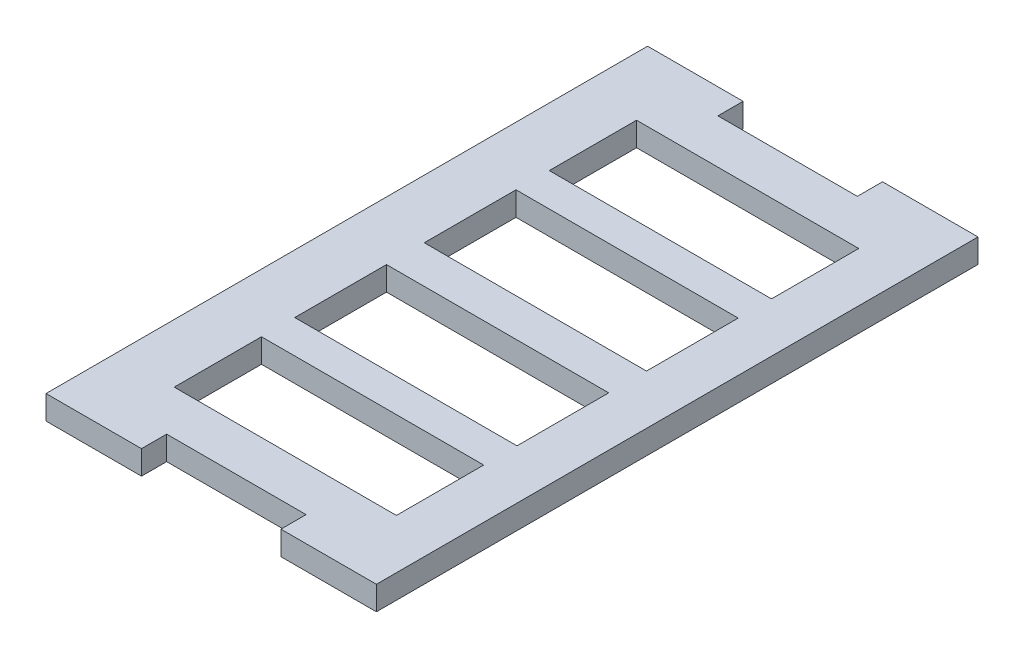
ISO-10303-21;
HEADER;
FILE_DESCRIPTION(('STEP AP214'),'2;1');
FILE_NAME('part.step','',(''),(''),'','','');
FILE_SCHEMA(('AUTOMOTIVE_DESIGN { 1 0 10303 214 1 1 1 1 }'));
ENDSEC;
DATA;
#1=APPLICATION_CONTEXT('core data for automotive mechanical design processes');
#2=APPLICATION_PROTOCOL_DEFINITION('international standard','automotive_design',2000,#1);
#3=PRODUCT_CONTEXT('',#1,'mechanical');
#4=PRODUCT('Part','Part','',(#3));
#5=PRODUCT_RELATED_PRODUCT_CATEGORY('part','',(#4));
#6=PRODUCT_DEFINITION_FORMATION('','',#4);
#7=PRODUCT_DEFINITION_CONTEXT('part definition',#1,'design');
#8=PRODUCT_DEFINITION('design','',#6,#7);
#9=PRODUCT_DEFINITION_SHAPE('','',#8);
#10=(LENGTH_UNIT() NAMED_UNIT(*) SI_UNIT(.MILLI.,.METRE.));
#11=(NAMED_UNIT(*) PLANE_ANGLE_UNIT() SI_UNIT($,.RADIAN.));
#12=(NAMED_UNIT(*) SI_UNIT($,.STERADIAN.) SOLID_ANGLE_UNIT());
#13=UNCERTAINTY_MEASURE_WITH_UNIT(LENGTH_MEASURE(1.E-05),#10,'distance_accuracy_value','');
#14=(GEOMETRIC_REPRESENTATION_CONTEXT(3) GLOBAL_UNCERTAINTY_ASSIGNED_CONTEXT((#13)) GLOBAL_UNIT_ASSIGNED_CONTEXT((#10,
#11,#12)) REPRESENTATION_CONTEXT('',''));
#15=CARTESIAN_POINT('',(0.,0.,0.));
#16=DIRECTION('',(0.,0.,1.));
#17=DIRECTION('',(1.,0.,0.));
#18=AXIS2_PLACEMENT_3D('',#15,#16,#17);
#19=CARTESIAN_POINT('',(0.,5.,0.));
#20=DIRECTION('',(0.,-1.,0.));
#21=DIRECTION('',(0.,0.,-1.));
#22=AXIS2_PLACEMENT_3D('',#19,#20,#21);
#23=PLANE('',#22);
#24=DIRECTION('',(1.,0.,0.));
#25=VECTOR('',#24,1.);
#26=CARTESIAN_POINT('',(-22.5088971814644,5.,55.734922510696));
#27=LINE('',#26,#25);
#28=CARTESIAN_POINT('',(-22.5088971814644,5.,55.734922510696));
#29=VERTEX_POINT('',#28);
#30=CARTESIAN_POINT('',(24.0307753905321,5.,55.734922510696));
#31=VERTEX_POINT('',#30);
#32=EDGE_CURVE('E254',#29,#31,#27,.T.);
#33=ORIENTED_EDGE('',*,*,#32,.F.);
#34=DIRECTION('',(0.,0.,1.));
#35=VECTOR('',#34,1.);
#36=CARTESIAN_POINT('',(-22.5088971814644,5.,55.734922510696));
#37=LINE('',#36,#35);
#38=CARTESIAN_POINT('',(-22.5088971814644,5.,36.5235838346414));
#39=VERTEX_POINT('',#38);
#40=EDGE_CURVE('E262',#39,#29,#37,.T.);
#41=ORIENTED_EDGE('',*,*,#40,.F.);
#42=DIRECTION('',(-1.,0.,0.));
#43=VECTOR('',#42,1.);
#44=CARTESIAN_POINT('',(-22.5088971814644,5.,36.5235838346414));
#45=LINE('',#44,#43);
#46=CARTESIAN_POINT('',(24.0307753905321,5.,36.5235838346414));
#47=VERTEX_POINT('',#46);
#48=EDGE_CURVE('E259',#47,#39,#45,.T.);
#49=ORIENTED_EDGE('',*,*,#48,.F.);
#50=DIRECTION('',(0.,0.,-1.));
#51=VECTOR('',#50,1.);
#52=CARTESIAN_POINT('',(24.0307753905321,5.,55.734922510696));
#53=LINE('',#52,#51);
#54=EDGE_CURVE('E256',#31,#47,#53,.T.);
#55=ORIENTED_EDGE('',*,*,#54,.F.);
#56=EDGE_LOOP('',(#33,#41,#49,#55));
#57=FACE_BOUND('',#56,.T.);
#58=DIRECTION('',(0.,0.,1.));
#59=VECTOR('',#58,1.);
#60=CARTESIAN_POINT('',(-22.5088971814644,5.,-15.8496267955484));
#61=LINE('',#60,#59);
#62=CARTESIAN_POINT('',(-22.5088971814644,5.,-15.8496267955484));
#63=VERTEX_POINT('',#62);
#64=CARTESIAN_POINT('',(-22.5088971814644,5.,2.42708672462842));
#65=VERTEX_POINT('',#64);
#66=EDGE_CURVE('E316',#63,#65,#61,.T.);
#67=ORIENTED_EDGE('',*,*,#66,.F.);
#68=DIRECTION('',(-1.,0.,0.));
#69=VECTOR('',#68,1.);
#70=CARTESIAN_POINT('',(-22.5088971814644,5.,-15.8496267955484));
#71=LINE('',#70,#69);
#72=CARTESIAN_POINT('',(24.0307753905321,5.,-15.8496267955484));
#73=VERTEX_POINT('',#72);
#74=EDGE_CURVE('E324',#73,#63,#71,.T.);
#75=ORIENTED_EDGE('',*,*,#74,.F.);
#76=DIRECTION('',(0.,0.,-1.));
#77=VECTOR('',#76,1.);
#78=CARTESIAN_POINT('',(24.0307753905321,5.,-15.8496267955484));
#79=LINE('',#78,#77);
#80=CARTESIAN_POINT('',(24.0307753905321,5.,2.42708672462842));
#81=VERTEX_POINT('',#80);
#82=EDGE_CURVE('E321',#81,#73,#79,.T.);
#83=ORIENTED_EDGE('',*,*,#82,.F.);
#84=DIRECTION('',(1.,0.,0.));
#85=VECTOR('',#84,1.);
#86=CARTESIAN_POINT('',(-22.5088971814644,5.,2.42708672462842));
#87=LINE('',#86,#85);
#88=EDGE_CURVE('E318',#65,#81,#87,.T.);
#89=ORIENTED_EDGE('',*,*,#88,.F.);
#90=EDGE_LOOP('',(#67,#75,#83,#89));
#91=FACE_BOUND('',#90,.T.);
#92=DIRECTION('',(0.,0.,1.));
#93=VECTOR('',#92,1.);
#94=CARTESIAN_POINT('',(-34.778811369509,5.,-25.4332304326133));
#95=LINE('',#94,#93);
#96=CARTESIAN_POINT('',(-34.778811369509,5.,-30.4332304326133));
#97=VERTEX_POINT('',#96);
#98=CARTESIAN_POINT('',(-34.778811369509,5.,95.5667695673867));
#99=VERTEX_POINT('',#98);
#100=EDGE_CURVE('E347',#97,#99,#95,.T.);
#101=ORIENTED_EDGE('',*,*,#100,.T.);
#102=DIRECTION('',(1.,0.,0.));
#103=VECTOR('',#102,1.);
#104=CARTESIAN_POINT('',(-34.778811369509,5.,95.5667695673867));
#105=LINE('',#104,#103);
#106=CARTESIAN_POINT('',(-14.778811369509,5.,95.5667695673867));
#107=VERTEX_POINT('',#106);
#108=EDGE_CURVE('E349',#99,#107,#105,.T.);
#109=ORIENTED_EDGE('',*,*,#108,.T.);
#110=DIRECTION('',(0.,0.,-1.));
#111=VECTOR('',#110,1.);
#112=CARTESIAN_POINT('',(-14.778811369509,5.,90.2959509895251));
#113=LINE('',#112,#111);
#114=CARTESIAN_POINT('',(-14.778811369509,5.,90.2959509895251));
#115=VERTEX_POINT('',#114);
#116=EDGE_CURVE('E352',#107,#115,#113,.T.);
#117=ORIENTED_EDGE('',*,*,#116,.T.);
#118=DIRECTION('',(1.,0.,0.));
#119=VECTOR('',#118,1.);
#120=CARTESIAN_POINT('',(-14.778811369509,5.,90.2959509895251));
#121=LINE('',#120,#119);
#122=CARTESIAN_POINT('',(14.421188630491,5.,90.2959509895251));
#123=VERTEX_POINT('',#122);
#124=EDGE_CURVE('E354',#115,#123,#121,.T.);
#125=ORIENTED_EDGE('',*,*,#124,.T.);
#126=DIRECTION('',(0.,0.,1.));
#127=VECTOR('',#126,1.);
#128=CARTESIAN_POINT('',(14.421188630491,5.,90.2959509895251));
#129=LINE('',#128,#127);
#130=CARTESIAN_POINT('',(14.421188630491,5.,95.5667695673867));
#131=VERTEX_POINT('',#130);
#132=EDGE_CURVE('E356',#123,#131,#129,.T.);
#133=ORIENTED_EDGE('',*,*,#132,.T.);
#134=DIRECTION('',(1.,0.,0.));
#135=VECTOR('',#134,1.);
#136=CARTESIAN_POINT('',(34.421188630491,5.,95.5667695673867));
#137=LINE('',#136,#135);
#138=CARTESIAN_POINT('',(34.421188630491,5.,95.5667695673867));
#139=VERTEX_POINT('',#138);
#140=EDGE_CURVE('E358',#131,#139,#137,.T.);
#141=ORIENTED_EDGE('',*,*,#140,.T.);
#142=DIRECTION('',(0.,0.,-1.));
#143=VECTOR('',#142,1.);
#144=CARTESIAN_POINT('',(34.421188630491,5.,90.5667695673867));
#145=LINE('',#144,#143);
#146=CARTESIAN_POINT('',(34.421188630491,5.,-30.4332304326133));
#147=VERTEX_POINT('',#146);
#148=EDGE_CURVE('E360',#139,#147,#145,.T.);
#149=ORIENTED_EDGE('',*,*,#148,.T.);
#150=DIRECTION('',(-1.,0.,0.));
#151=VECTOR('',#150,1.);
#152=CARTESIAN_POINT('',(34.421188630491,5.,-30.4332304326133));
#153=LINE('',#152,#151);
#154=CARTESIAN_POINT('',(14.421188630491,5.,-30.4332304326133));
#155=VERTEX_POINT('',#154);
#156=EDGE_CURVE('E362',#147,#155,#153,.T.);
#157=ORIENTED_EDGE('',*,*,#156,.T.);
#158=DIRECTION('',(0.,0.,1.));
#159=VECTOR('',#158,1.);
#160=CARTESIAN_POINT('',(14.421188630491,5.,-25.1624118547518));
#161=LINE('',#160,#159);
#162=CARTESIAN_POINT('',(14.421188630491,5.,-25.1624118547518));
#163=VERTEX_POINT('',#162);
#164=EDGE_CURVE('E364',#155,#163,#161,.T.);
#165=ORIENTED_EDGE('',*,*,#164,.T.);
#166=DIRECTION('',(-1.,0.,0.));
#167=VECTOR('',#166,1.);
#168=CARTESIAN_POINT('',(-14.778811369509,5.,-25.1624118547518));
#169=LINE('',#168,#167);
#170=CARTESIAN_POINT('',(-14.778811369509,5.,-25.1624118547518));
#171=VERTEX_POINT('',#170);
#172=EDGE_CURVE('E366',#163,#171,#169,.T.);
#173=ORIENTED_EDGE('',*,*,#172,.T.);
#174=DIRECTION('',(0.,0.,-1.));
#175=VECTOR('',#174,1.);
#176=CARTESIAN_POINT('',(-14.778811369509,5.,-25.1624118547518));
#177=LINE('',#176,#175);
#178=CARTESIAN_POINT('',(-14.778811369509,5.,-30.4332304326133));
#179=VERTEX_POINT('',#178);
#180=EDGE_CURVE('E368',#171,#179,#177,.T.);
#181=ORIENTED_EDGE('',*,*,#180,.T.);
#182=DIRECTION('',(-1.,0.,0.));
#183=VECTOR('',#182,1.);
#184=CARTESIAN_POINT('',(-34.778811369509,5.,-30.4332304326133));
#185=LINE('',#184,#183);
#186=EDGE_CURVE('E370',#179,#97,#185,.T.);
#187=ORIENTED_EDGE('',*,*,#186,.T.);
#188=EDGE_LOOP('',(#101,#109,#117,#125,#133,#141,#149,#157,#165,#173,#181,#187));
#189=FACE_BOUND('',#188,.T.);
#190=DIRECTION('',(0.,0.,1.));
#191=VECTOR('',#190,1.);
#192=CARTESIAN_POINT('',(-22.5088971814644,5.,9.39861662407728));
#193=LINE('',#192,#191);
#194=CARTESIAN_POINT('',(-22.5088971814644,5.,9.39861662407728));
#195=VERTEX_POINT('',#194);
#196=CARTESIAN_POINT('',(-22.5088971814644,5.,28.6099553001319));
#197=VERTEX_POINT('',#196);
#198=EDGE_CURVE('E285',#195,#197,#193,.T.);
#199=ORIENTED_EDGE('',*,*,#198,.F.);
#200=DIRECTION('',(-1.,0.,0.));
#201=VECTOR('',#200,1.);
#202=CARTESIAN_POINT('',(-22.5088971814644,5.,9.39861662407728));
#203=LINE('',#202,#201);
#204=CARTESIAN_POINT('',(24.0307753905321,5.,9.39861662407728));
#205=VERTEX_POINT('',#204);
#206=EDGE_CURVE('E293',#205,#195,#203,.T.);
#207=ORIENTED_EDGE('',*,*,#206,.F.);
#208=DIRECTION('',(0.,0.,-1.));
#209=VECTOR('',#208,1.);
#210=CARTESIAN_POINT('',(24.0307753905321,5.,9.39861662407728));
#211=LINE('',#210,#209);
#212=CARTESIAN_POINT('',(24.0307753905321,5.,28.6099553001319));
#213=VERTEX_POINT('',#212);
#214=EDGE_CURVE('E290',#213,#205,#211,.T.);
#215=ORIENTED_EDGE('',*,*,#214,.F.);
#216=DIRECTION('',(1.,0.,0.));
#217=VECTOR('',#216,1.);
#218=CARTESIAN_POINT('',(-22.5088971814644,5.,28.6099553001319));
#219=LINE('',#218,#217);
#220=EDGE_CURVE('E287',#197,#213,#219,.T.);
#221=ORIENTED_EDGE('',*,*,#220,.F.);
#222=EDGE_LOOP('',(#199,#207,#215,#221));
#223=FACE_BOUND('',#222,.T.);
#224=DIRECTION('',(1.,0.,0.));
#225=VECTOR('',#224,1.);
#226=CARTESIAN_POINT('',(-22.5088971814644,5.,80.9831659303217));
#227=LINE('',#226,#225);
#228=CARTESIAN_POINT('',(-22.5088971814644,5.,80.9831659303217));
#229=VERTEX_POINT('',#228);
#230=CARTESIAN_POINT('',(24.0307753905321,5.,80.9831659303217));
#231=VERTEX_POINT('',#230);
#232=EDGE_CURVE('E218',#229,#231,#227,.T.);
#233=ORIENTED_EDGE('',*,*,#232,.F.);
#234=DIRECTION('',(0.,0.,1.));
#235=VECTOR('',#234,1.);
#236=CARTESIAN_POINT('',(-22.5088971814644,5.,80.9831659303217));
#237=LINE('',#236,#235);
#238=CARTESIAN_POINT('',(-22.5088971814644,5.,62.7064524101449));
#239=VERTEX_POINT('',#238);
#240=EDGE_CURVE('E240',#239,#229,#237,.T.);
#241=ORIENTED_EDGE('',*,*,#240,.F.);
#242=DIRECTION('',(-1.,0.,0.));
#243=VECTOR('',#242,1.);
#244=CARTESIAN_POINT('',(-22.5088971814644,5.,62.7064524101449));
#245=LINE('',#244,#243);
#246=CARTESIAN_POINT('',(24.0307753905321,5.,62.7064524101449));
#247=VERTEX_POINT('',#246);
#248=EDGE_CURVE('E238',#247,#239,#245,.T.);
#249=ORIENTED_EDGE('',*,*,#248,.F.);
#250=DIRECTION('',(0.,0.,-1.));
#251=VECTOR('',#250,1.);
#252=CARTESIAN_POINT('',(24.0307753905321,5.,80.9831659303217));
#253=LINE('',#252,#251);
#254=EDGE_CURVE('E226',#231,#247,#253,.T.);
#255=ORIENTED_EDGE('',*,*,#254,.F.);
#256=EDGE_LOOP('',(#233,#241,#249,#255));
#257=FACE_BOUND('',#256,.T.);
#258=ADVANCED_FACE('F33',(#57,#91,#189,#223,#257),#23,.F.);
#259=CARTESIAN_POINT('',(0.,0.,0.));
#260=DIRECTION('',(0.,-1.,0.));
#261=DIRECTION('',(0.,0.,-1.));
#262=AXIS2_PLACEMENT_3D('',#259,#260,#261);
#263=PLANE('',#262);
#264=DIRECTION('',(0.,0.,1.));
#265=VECTOR('',#264,1.);
#266=CARTESIAN_POINT('',(-34.778811369509,0.,90.5667695673867));
#267=LINE('',#266,#265);
#268=CARTESIAN_POINT('',(-34.778811369509,0.,-30.4332304326133));
#269=VERTEX_POINT('',#268);
#270=CARTESIAN_POINT('',(-34.778811369509,0.,95.5667695673867));
#271=VERTEX_POINT('',#270);
#272=EDGE_CURVE('E346',#269,#271,#267,.T.);
#273=ORIENTED_EDGE('',*,*,#272,.F.);
#274=DIRECTION('',(-1.,0.,0.));
#275=VECTOR('',#274,1.);
#276=CARTESIAN_POINT('',(-34.778811369509,0.,-30.4332304326133));
#277=LINE('',#276,#275);
#278=CARTESIAN_POINT('',(-14.778811369509,0.,-30.4332304326133));
#279=VERTEX_POINT('',#278);
#280=EDGE_CURVE('E350',#279,#269,#277,.T.);
#281=ORIENTED_EDGE('',*,*,#280,.F.);
#282=DIRECTION('',(0.,0.,-1.));
#283=VECTOR('',#282,1.);
#284=CARTESIAN_POINT('',(-14.778811369509,0.,-25.1624118547518));
#285=LINE('',#284,#283);
#286=CARTESIAN_POINT('',(-14.778811369509,0.,-25.1624118547518));
#287=VERTEX_POINT('',#286);
#288=EDGE_CURVE('E393',#287,#279,#285,.T.);
#289=ORIENTED_EDGE('',*,*,#288,.F.);
#290=DIRECTION('',(-1.,0.,0.));
#291=VECTOR('',#290,1.);
#292=CARTESIAN_POINT('',(-14.778811369509,0.,-25.1624118547518));
#293=LINE('',#292,#291);
#294=CARTESIAN_POINT('',(14.421188630491,0.,-25.1624118547518));
#295=VERTEX_POINT('',#294);
#296=EDGE_CURVE('E391',#295,#287,#293,.T.);
#297=ORIENTED_EDGE('',*,*,#296,.F.);
#298=DIRECTION('',(0.,0.,1.));
#299=VECTOR('',#298,1.);
#300=CARTESIAN_POINT('',(14.421188630491,0.,-25.1624118547518));
#301=LINE('',#300,#299);
#302=CARTESIAN_POINT('',(14.421188630491,0.,-30.4332304326133));
#303=VERTEX_POINT('',#302);
#304=EDGE_CURVE('E389',#303,#295,#301,.T.);
#305=ORIENTED_EDGE('',*,*,#304,.F.);
#306=DIRECTION('',(-1.,0.,0.));
#307=VECTOR('',#306,1.);
#308=CARTESIAN_POINT('',(34.421188630491,0.,-30.4332304326133));
#309=LINE('',#308,#307);
#310=CARTESIAN_POINT('',(34.421188630491,0.,-30.4332304326133));
#311=VERTEX_POINT('',#310);
#312=EDGE_CURVE('E387',#311,#303,#309,.T.);
#313=ORIENTED_EDGE('',*,*,#312,.F.);
#314=DIRECTION('',(0.,0.,-1.));
#315=VECTOR('',#314,1.);
#316=CARTESIAN_POINT('',(34.421188630491,0.,-25.4332304326133));
#317=LINE('',#316,#315);
#318=CARTESIAN_POINT('',(34.421188630491,0.,95.5667695673867));
#319=VERTEX_POINT('',#318);
#320=EDGE_CURVE('E385',#319,#311,#317,.T.);
#321=ORIENTED_EDGE('',*,*,#320,.F.);
#322=DIRECTION('',(1.,0.,0.));
#323=VECTOR('',#322,1.);
#324=CARTESIAN_POINT('',(34.421188630491,0.,95.5667695673867));
#325=LINE('',#324,#323);
#326=CARTESIAN_POINT('',(14.421188630491,0.,95.5667695673867));
#327=VERTEX_POINT('',#326);
#328=EDGE_CURVE('E382',#327,#319,#325,.T.);
#329=ORIENTED_EDGE('',*,*,#328,.F.);
#330=DIRECTION('',(0.,0.,1.));
#331=VECTOR('',#330,1.);
#332=CARTESIAN_POINT('',(14.421188630491,0.,90.2959509895251));
#333=LINE('',#332,#331);
#334=CARTESIAN_POINT('',(14.421188630491,0.,90.2959509895251));
#335=VERTEX_POINT('',#334);
#336=EDGE_CURVE('E380',#335,#327,#333,.T.);
#337=ORIENTED_EDGE('',*,*,#336,.F.);
#338=DIRECTION('',(1.,0.,0.));
#339=VECTOR('',#338,1.);
#340=CARTESIAN_POINT('',(-14.778811369509,0.,90.2959509895251));
#341=LINE('',#340,#339);
#342=CARTESIAN_POINT('',(-14.778811369509,0.,90.2959509895251));
#343=VERTEX_POINT('',#342);
#344=EDGE_CURVE('E378',#343,#335,#341,.T.);
#345=ORIENTED_EDGE('',*,*,#344,.F.);
#346=DIRECTION('',(0.,0.,-1.));
#347=VECTOR('',#346,1.);
#348=CARTESIAN_POINT('',(-14.778811369509,0.,90.2959509895251));
#349=LINE('',#348,#347);
#350=CARTESIAN_POINT('',(-14.778811369509,0.,95.5667695673867));
#351=VERTEX_POINT('',#350);
#352=EDGE_CURVE('E376',#351,#343,#349,.T.);
#353=ORIENTED_EDGE('',*,*,#352,.F.);
#354=DIRECTION('',(1.,0.,0.));
#355=VECTOR('',#354,1.);
#356=CARTESIAN_POINT('',(-34.778811369509,0.,95.5667695673867));
#357=LINE('',#356,#355);
#358=EDGE_CURVE('E374',#271,#351,#357,.T.);
#359=ORIENTED_EDGE('',*,*,#358,.F.);
#360=EDGE_LOOP('',(#273,#281,#289,#297,#305,#313,#321,#329,#337,#345,#353,#359));
#361=FACE_BOUND('',#360,.T.);
#362=DIRECTION('',(-1.,0.,0.));
#363=VECTOR('',#362,1.);
#364=CARTESIAN_POINT('',(-22.5088971814644,0.,-15.8496267955484));
#365=LINE('',#364,#363);
#366=CARTESIAN_POINT('',(24.0307753905321,0.,-15.8496267955484));
#367=VERTEX_POINT('',#366);
#368=CARTESIAN_POINT('',(-22.5088971814644,0.,-15.8496267955484));
#369=VERTEX_POINT('',#368);
#370=EDGE_CURVE('E319',#367,#369,#365,.T.);
#371=ORIENTED_EDGE('',*,*,#370,.T.);
#372=DIRECTION('',(0.,0.,1.));
#373=VECTOR('',#372,1.);
#374=CARTESIAN_POINT('',(-22.5088971814644,0.,-15.8496267955484));
#375=LINE('',#374,#373);
#376=CARTESIAN_POINT('',(-22.5088971814644,0.,2.42708672462842));
#377=VERTEX_POINT('',#376);
#378=EDGE_CURVE('E315',#369,#377,#375,.T.);
#379=ORIENTED_EDGE('',*,*,#378,.T.);
#380=DIRECTION('',(1.,0.,0.));
#381=VECTOR('',#380,1.);
#382=CARTESIAN_POINT('',(-22.5088971814644,0.,2.42708672462842));
#383=LINE('',#382,#381);
#384=CARTESIAN_POINT('',(24.0307753905321,0.,2.42708672462842));
#385=VERTEX_POINT('',#384);
#386=EDGE_CURVE('E329',#377,#385,#383,.T.);
#387=ORIENTED_EDGE('',*,*,#386,.T.);
#388=DIRECTION('',(0.,0.,-1.));
#389=VECTOR('',#388,1.);
#390=CARTESIAN_POINT('',(24.0307753905321,0.,-15.8496267955484));
#391=LINE('',#390,#389);
#392=EDGE_CURVE('E332',#385,#367,#391,.T.);
#393=ORIENTED_EDGE('',*,*,#392,.T.);
#394=EDGE_LOOP('',(#371,#379,#387,#393));
#395=FACE_BOUND('',#394,.T.);
#396=DIRECTION('',(-1.,0.,0.));
#397=VECTOR('',#396,1.);
#398=CARTESIAN_POINT('',(-22.5088971814644,0.,9.39861662407728));
#399=LINE('',#398,#397);
#400=CARTESIAN_POINT('',(24.0307753905321,0.,9.39861662407728));
#401=VERTEX_POINT('',#400);
#402=CARTESIAN_POINT('',(-22.5088971814644,0.,9.39861662407728));
#403=VERTEX_POINT('',#402);
#404=EDGE_CURVE('E288',#401,#403,#399,.T.);
#405=ORIENTED_EDGE('',*,*,#404,.T.);
#406=DIRECTION('',(0.,0.,1.));
#407=VECTOR('',#406,1.);
#408=CARTESIAN_POINT('',(-22.5088971814644,0.,9.39861662407728));
#409=LINE('',#408,#407);
#410=CARTESIAN_POINT('',(-22.5088971814644,0.,28.6099553001319));
#411=VERTEX_POINT('',#410);
#412=EDGE_CURVE('E284',#403,#411,#409,.T.);
#413=ORIENTED_EDGE('',*,*,#412,.T.);
#414=DIRECTION('',(1.,0.,0.));
#415=VECTOR('',#414,1.);
#416=CARTESIAN_POINT('',(-22.5088971814644,0.,28.6099553001319));
#417=LINE('',#416,#415);
#418=CARTESIAN_POINT('',(24.0307753905321,0.,28.6099553001319));
#419=VERTEX_POINT('',#418);
#420=EDGE_CURVE('E298',#411,#419,#417,.T.);
#421=ORIENTED_EDGE('',*,*,#420,.T.);
#422=DIRECTION('',(0.,0.,-1.));
#423=VECTOR('',#422,1.);
#424=CARTESIAN_POINT('',(24.0307753905321,0.,9.39861662407728));
#425=LINE('',#424,#423);
#426=EDGE_CURVE('E301',#419,#401,#425,.T.);
#427=ORIENTED_EDGE('',*,*,#426,.T.);
#428=EDGE_LOOP('',(#405,#413,#421,#427));
#429=FACE_BOUND('',#428,.T.);
#430=DIRECTION('',(0.,0.,1.));
#431=VECTOR('',#430,1.);
#432=CARTESIAN_POINT('',(-22.5088971814644,0.,55.734922510696));
#433=LINE('',#432,#431);
#434=CARTESIAN_POINT('',(-22.5088971814644,0.,36.5235838346414));
#435=VERTEX_POINT('',#434);
#436=CARTESIAN_POINT('',(-22.5088971814644,0.,55.734922510696));
#437=VERTEX_POINT('',#436);
#438=EDGE_CURVE('E257',#435,#437,#433,.T.);
#439=ORIENTED_EDGE('',*,*,#438,.T.);
#440=DIRECTION('',(1.,0.,0.));
#441=VECTOR('',#440,1.);
#442=CARTESIAN_POINT('',(-22.5088971814644,0.,55.734922510696));
#443=LINE('',#442,#441);
#444=CARTESIAN_POINT('',(24.0307753905321,0.,55.734922510696));
#445=VERTEX_POINT('',#444);
#446=EDGE_CURVE('E234',#437,#445,#443,.T.);
#447=ORIENTED_EDGE('',*,*,#446,.T.);
#448=DIRECTION('',(0.,0.,-1.));
#449=VECTOR('',#448,1.);
#450=CARTESIAN_POINT('',(24.0307753905321,0.,55.734922510696));
#451=LINE('',#450,#449);
#452=CARTESIAN_POINT('',(24.0307753905321,0.,36.5235838346414));
#453=VERTEX_POINT('',#452);
#454=EDGE_CURVE('E267',#445,#453,#451,.T.);
#455=ORIENTED_EDGE('',*,*,#454,.T.);
#456=DIRECTION('',(-1.,0.,0.));
#457=VECTOR('',#456,1.);
#458=CARTESIAN_POINT('',(-22.5088971814644,0.,36.5235838346414));
#459=LINE('',#458,#457);
#460=EDGE_CURVE('E270',#453,#435,#459,.T.);
#461=ORIENTED_EDGE('',*,*,#460,.T.);
#462=EDGE_LOOP('',(#439,#447,#455,#461));
#463=FACE_BOUND('',#462,.T.);
#464=DIRECTION('',(0.,0.,1.));
#465=VECTOR('',#464,1.);
#466=CARTESIAN_POINT('',(-22.5088971814644,0.,80.9831659303217));
#467=LINE('',#466,#465);
#468=CARTESIAN_POINT('',(-22.5088971814644,0.,62.7064524101449));
#469=VERTEX_POINT('',#468);
#470=CARTESIAN_POINT('',(-22.5088971814644,0.,80.9831659303217));
#471=VERTEX_POINT('',#470);
#472=EDGE_CURVE('E227',#469,#471,#467,.T.);
#473=ORIENTED_EDGE('',*,*,#472,.T.);
#474=DIRECTION('',(1.,0.,0.));
#475=VECTOR('',#474,1.);
#476=CARTESIAN_POINT('',(-22.5088971814644,0.,80.9831659303217));
#477=LINE('',#476,#475);
#478=CARTESIAN_POINT('',(24.0307753905321,0.,80.9831659303217));
#479=VERTEX_POINT('',#478);
#480=EDGE_CURVE('E56',#471,#479,#477,.T.);
#481=ORIENTED_EDGE('',*,*,#480,.T.);
#482=DIRECTION('',(0.,0.,-1.));
#483=VECTOR('',#482,1.);
#484=CARTESIAN_POINT('',(24.0307753905321,0.,80.9831659303217));
#485=LINE('',#484,#483);
#486=CARTESIAN_POINT('',(24.0307753905321,0.,62.7064524101449));
#487=VERTEX_POINT('',#486);
#488=EDGE_CURVE('E233',#479,#487,#485,.T.);
#489=ORIENTED_EDGE('',*,*,#488,.T.);
#490=DIRECTION('',(-1.,0.,0.));
#491=VECTOR('',#490,1.);
#492=CARTESIAN_POINT('',(-22.5088971814644,0.,62.7064524101449));
#493=LINE('',#492,#491);
#494=EDGE_CURVE('E246',#487,#469,#493,.T.);
#495=ORIENTED_EDGE('',*,*,#494,.T.);
#496=EDGE_LOOP('',(#473,#481,#489,#495));
#497=FACE_BOUND('',#496,.T.);
#498=ADVANCED_FACE('F437',(#361,#395,#429,#463,#497),#263,.T.);
#499=CARTESIAN_POINT('',(-34.778811369509,5.,90.5667695673867));
#500=DIRECTION('',(1.,0.,0.));
#501=DIRECTION('',(0.,0.,-1.));
#502=AXIS2_PLACEMENT_3D('',#499,#500,#501);
#503=PLANE('',#502);
#504=ORIENTED_EDGE('',*,*,#272,.T.);
#505=DIRECTION('',(0.,-1.,0.));
#506=VECTOR('',#505,1.);
#507=CARTESIAN_POINT('',(-34.778811369509,5.,95.5667695673867));
#508=LINE('',#507,#506);
#509=EDGE_CURVE('E11',#99,#271,#508,.T.);
#510=ORIENTED_EDGE('',*,*,#509,.F.);
#511=ORIENTED_EDGE('',*,*,#100,.F.);
#512=DIRECTION('',(0.,-1.,0.));
#513=VECTOR('',#512,1.);
#514=CARTESIAN_POINT('',(-34.778811369509,5.,-30.4332304326133));
#515=LINE('',#514,#513);
#516=EDGE_CURVE('E372',#97,#269,#515,.T.);
#517=ORIENTED_EDGE('',*,*,#516,.T.);
#518=EDGE_LOOP('',(#504,#510,#511,#517));
#519=FACE_BOUND('',#518,.T.);
#520=ADVANCED_FACE('F35',(#519),#503,.F.);
#521=CARTESIAN_POINT('',(-34.778811369509,5.,95.5667695673867));
#522=DIRECTION('',(0.,0.,-1.));
#523=DIRECTION('',(-1.,0.,0.));
#524=AXIS2_PLACEMENT_3D('',#521,#522,#523);
#525=PLANE('',#524);
#526=ORIENTED_EDGE('',*,*,#358,.T.);
#527=DIRECTION('',(0.,-1.,0.));
#528=VECTOR('',#527,1.);
#529=CARTESIAN_POINT('',(-14.778811369509,5.,95.5667695673867));
#530=LINE('',#529,#528);
#531=EDGE_CURVE('E41',#107,#351,#530,.T.);
#532=ORIENTED_EDGE('',*,*,#531,.F.);
#533=ORIENTED_EDGE('',*,*,#108,.F.);
#534=ORIENTED_EDGE('',*,*,#509,.T.);
#535=EDGE_LOOP('',(#526,#532,#533,#534));
#536=FACE_BOUND('',#535,.T.);
#537=ADVANCED_FACE('F455',(#536),#525,.F.);
#538=CARTESIAN_POINT('',(-14.778811369509,5.,90.2959509895251));
#539=DIRECTION('',(-1.,0.,0.));
#540=DIRECTION('',(0.,0.,1.));
#541=AXIS2_PLACEMENT_3D('',#538,#539,#540);
#542=PLANE('',#541);
#543=ORIENTED_EDGE('',*,*,#352,.T.);
#544=DIRECTION('',(0.,-1.,0.));
#545=VECTOR('',#544,1.);
#546=CARTESIAN_POINT('',(-14.778811369509,5.,90.2959509895251));
#547=LINE('',#546,#545);
#548=EDGE_CURVE('E423',#115,#343,#547,.T.);
#549=ORIENTED_EDGE('',*,*,#548,.F.);
#550=ORIENTED_EDGE('',*,*,#116,.F.);
#551=ORIENTED_EDGE('',*,*,#531,.T.);
#552=EDGE_LOOP('',(#543,#549,#550,#551));
#553=FACE_BOUND('',#552,.T.);
#554=ADVANCED_FACE('F430',(#553),#542,.F.);
#555=CARTESIAN_POINT('',(-14.778811369509,5.,90.2959509895251));
#556=DIRECTION('',(0.,0.,-1.));
#557=DIRECTION('',(-1.,0.,0.));
#558=AXIS2_PLACEMENT_3D('',#555,#556,#557);
#559=PLANE('',#558);
#560=ORIENTED_EDGE('',*,*,#344,.T.);
#561=DIRECTION('',(0.,-1.,0.));
#562=VECTOR('',#561,1.);
#563=CARTESIAN_POINT('',(14.421188630491,5.,90.2959509895251));
#564=LINE('',#563,#562);
#565=EDGE_CURVE('E420',#123,#335,#564,.T.);
#566=ORIENTED_EDGE('',*,*,#565,.F.);
#567=ORIENTED_EDGE('',*,*,#124,.F.);
#568=ORIENTED_EDGE('',*,*,#548,.T.);
#569=EDGE_LOOP('',(#560,#566,#567,#568));
#570=FACE_BOUND('',#569,.T.);
#571=ADVANCED_FACE('F443',(#570),#559,.F.);
#572=CARTESIAN_POINT('',(14.421188630491,5.,90.2959509895251));
#573=DIRECTION('',(1.,0.,0.));
#574=DIRECTION('',(0.,0.,-1.));
#575=AXIS2_PLACEMENT_3D('',#572,#573,#574);
#576=PLANE('',#575);
#577=ORIENTED_EDGE('',*,*,#336,.T.);
#578=DIRECTION('',(0.,-1.,0.));
#579=VECTOR('',#578,1.);
#580=CARTESIAN_POINT('',(14.421188630491,5.,95.5667695673867));
#581=LINE('',#580,#579);
#582=EDGE_CURVE('E417',#131,#327,#581,.T.);
#583=ORIENTED_EDGE('',*,*,#582,.F.);
#584=ORIENTED_EDGE('',*,*,#132,.F.);
#585=ORIENTED_EDGE('',*,*,#565,.T.);
#586=EDGE_LOOP('',(#577,#583,#584,#585));
#587=FACE_BOUND('',#586,.T.);
#588=ADVANCED_FACE('F447',(#587),#576,.F.);
#589=CARTESIAN_POINT('',(34.421188630491,5.,95.5667695673867));
#590=DIRECTION('',(0.,0.,-1.));
#591=DIRECTION('',(-1.,0.,0.));
#592=AXIS2_PLACEMENT_3D('',#589,#590,#591);
#593=PLANE('',#592);
#594=ORIENTED_EDGE('',*,*,#328,.T.);
#595=DIRECTION('',(0.,-1.,0.));
#596=VECTOR('',#595,1.);
#597=CARTESIAN_POINT('',(34.421188630491,5.,95.5667695673867));
#598=LINE('',#597,#596);
#599=EDGE_CURVE('E414',#139,#319,#598,.T.);
#600=ORIENTED_EDGE('',*,*,#599,.F.);
#601=ORIENTED_EDGE('',*,*,#140,.F.);
#602=ORIENTED_EDGE('',*,*,#582,.T.);
#603=EDGE_LOOP('',(#594,#600,#601,#602));
#604=FACE_BOUND('',#603,.T.);
#605=ADVANCED_FACE('F485',(#604),#593,.F.);
#606=CARTESIAN_POINT('',(34.421188630491,5.,-25.4332304326133));
#607=DIRECTION('',(-1.,0.,0.));
#608=DIRECTION('',(0.,0.,1.));
#609=AXIS2_PLACEMENT_3D('',#606,#607,#608);
#610=PLANE('',#609);
#611=ORIENTED_EDGE('',*,*,#320,.T.);
#612=DIRECTION('',(0.,-1.,0.));
#613=VECTOR('',#612,1.);
#614=CARTESIAN_POINT('',(34.421188630491,5.,-30.4332304326133));
#615=LINE('',#614,#613);
#616=EDGE_CURVE('E411',#147,#311,#615,.T.);
#617=ORIENTED_EDGE('',*,*,#616,.F.);
#618=ORIENTED_EDGE('',*,*,#148,.F.);
#619=ORIENTED_EDGE('',*,*,#599,.T.);
#620=EDGE_LOOP('',(#611,#617,#618,#619));
#621=FACE_BOUND('',#620,.T.);
#622=ADVANCED_FACE('F487',(#621),#610,.F.);
#623=CARTESIAN_POINT('',(34.421188630491,5.,-30.4332304326133));
#624=DIRECTION('',(0.,0.,1.));
#625=DIRECTION('',(1.,0.,0.));
#626=AXIS2_PLACEMENT_3D('',#623,#624,#625);
#627=PLANE('',#626);
#628=ORIENTED_EDGE('',*,*,#312,.T.);
#629=DIRECTION('',(0.,-1.,0.));
#630=VECTOR('',#629,1.);
#631=CARTESIAN_POINT('',(14.421188630491,5.,-30.4332304326133));
#632=LINE('',#631,#630);
#633=EDGE_CURVE('E408',#155,#303,#632,.T.);
#634=ORIENTED_EDGE('',*,*,#633,.F.);
#635=ORIENTED_EDGE('',*,*,#156,.F.);
#636=ORIENTED_EDGE('',*,*,#616,.T.);
#637=EDGE_LOOP('',(#628,#634,#635,#636));
#638=FACE_BOUND('',#637,.T.);
#639=ADVANCED_FACE('F481',(#638),#627,.F.);
#640=CARTESIAN_POINT('',(14.421188630491,5.,-25.1624118547518));
#641=DIRECTION('',(1.,0.,0.));
#642=DIRECTION('',(0.,0.,-1.));
#643=AXIS2_PLACEMENT_3D('',#640,#641,#642);
#644=PLANE('',#643);
#645=ORIENTED_EDGE('',*,*,#304,.T.);
#646=DIRECTION('',(0.,-1.,0.));
#647=VECTOR('',#646,1.);
#648=CARTESIAN_POINT('',(14.421188630491,5.,-25.1624118547518));
#649=LINE('',#648,#647);
#650=EDGE_CURVE('E405',#163,#295,#649,.T.);
#651=ORIENTED_EDGE('',*,*,#650,.F.);
#652=ORIENTED_EDGE('',*,*,#164,.F.);
#653=ORIENTED_EDGE('',*,*,#633,.T.);
#654=EDGE_LOOP('',(#645,#651,#652,#653));
#655=FACE_BOUND('',#654,.T.);
#656=ADVANCED_FACE('F477',(#655),#644,.F.);
#657=CARTESIAN_POINT('',(-14.778811369509,5.,-25.1624118547518));
#658=DIRECTION('',(0.,0.,1.));
#659=DIRECTION('',(1.,0.,0.));
#660=AXIS2_PLACEMENT_3D('',#657,#658,#659);
#661=PLANE('',#660);
#662=ORIENTED_EDGE('',*,*,#296,.T.);
#663=DIRECTION('',(0.,-1.,0.));
#664=VECTOR('',#663,1.);
#665=CARTESIAN_POINT('',(-14.778811369509,5.,-25.1624118547518));
#666=LINE('',#665,#664);
#667=EDGE_CURVE('E402',#171,#287,#666,.T.);
#668=ORIENTED_EDGE('',*,*,#667,.F.);
#669=ORIENTED_EDGE('',*,*,#172,.F.);
#670=ORIENTED_EDGE('',*,*,#650,.T.);
#671=EDGE_LOOP('',(#662,#668,#669,#670));
#672=FACE_BOUND('',#671,.T.);
#673=ADVANCED_FACE('F472',(#672),#661,.F.);
#674=CARTESIAN_POINT('',(-14.778811369509,5.,-25.1624118547518));
#675=DIRECTION('',(-1.,0.,0.));
#676=DIRECTION('',(0.,0.,1.));
#677=AXIS2_PLACEMENT_3D('',#674,#675,#676);
#678=PLANE('',#677);
#679=ORIENTED_EDGE('',*,*,#288,.T.);
#680=DIRECTION('',(0.,-1.,0.));
#681=VECTOR('',#680,1.);
#682=CARTESIAN_POINT('',(-14.778811369509,5.,-30.4332304326133));
#683=LINE('',#682,#681);
#684=EDGE_CURVE('E399',#179,#279,#683,.T.);
#685=ORIENTED_EDGE('',*,*,#684,.F.);
#686=ORIENTED_EDGE('',*,*,#180,.F.);
#687=ORIENTED_EDGE('',*,*,#667,.T.);
#688=EDGE_LOOP('',(#679,#685,#686,#687));
#689=FACE_BOUND('',#688,.T.);
#690=ADVANCED_FACE('F466',(#689),#678,.F.);
#691=CARTESIAN_POINT('',(-34.778811369509,5.,-30.4332304326133));
#692=DIRECTION('',(0.,0.,1.));
#693=DIRECTION('',(1.,0.,0.));
#694=AXIS2_PLACEMENT_3D('',#691,#692,#693);
#695=PLANE('',#694);
#696=ORIENTED_EDGE('',*,*,#280,.T.);
#697=ORIENTED_EDGE('',*,*,#516,.F.);
#698=ORIENTED_EDGE('',*,*,#186,.F.);
#699=ORIENTED_EDGE('',*,*,#684,.T.);
#700=EDGE_LOOP('',(#696,#697,#698,#699));
#701=FACE_BOUND('',#700,.T.);
#702=ADVANCED_FACE('F461',(#701),#695,.F.);
#703=CARTESIAN_POINT('',(-22.5088971814644,5.,-15.8496267955484));
#704=DIRECTION('',(1.,0.,0.));
#705=DIRECTION('',(0.,0.,-1.));
#706=AXIS2_PLACEMENT_3D('',#703,#704,#705);
#707=PLANE('',#706);
#708=ORIENTED_EDGE('',*,*,#378,.F.);
#709=DIRECTION('',(0.,-1.,0.));
#710=VECTOR('',#709,1.);
#711=CARTESIAN_POINT('',(-22.5088971814644,5.,-15.8496267955484));
#712=LINE('',#711,#710);
#713=EDGE_CURVE('E326',#63,#369,#712,.T.);
#714=ORIENTED_EDGE('',*,*,#713,.F.);
#715=ORIENTED_EDGE('',*,*,#66,.T.);
#716=DIRECTION('',(0.,-1.,0.));
#717=VECTOR('',#716,1.);
#718=CARTESIAN_POINT('',(-22.5088971814644,5.,2.42708672462842));
#719=LINE('',#718,#717);
#720=EDGE_CURVE('E343',#65,#377,#719,.T.);
#721=ORIENTED_EDGE('',*,*,#720,.T.);
#722=EDGE_LOOP('',(#708,#714,#715,#721));
#723=FACE_BOUND('',#722,.T.);
#724=ADVANCED_FACE('F506',(#723),#707,.T.);
#725=CARTESIAN_POINT('',(-22.5088971814644,5.,2.42708672462842));
#726=DIRECTION('',(0.,0.,-1.));
#727=DIRECTION('',(-1.,0.,0.));
#728=AXIS2_PLACEMENT_3D('',#725,#726,#727);
#729=PLANE('',#728);
#730=ORIENTED_EDGE('',*,*,#386,.F.);
#731=ORIENTED_EDGE('',*,*,#720,.F.);
#732=ORIENTED_EDGE('',*,*,#88,.T.);
#733=DIRECTION('',(0.,-1.,0.));
#734=VECTOR('',#733,1.);
#735=CARTESIAN_POINT('',(24.0307753905321,5.,2.42708672462842));
#736=LINE('',#735,#734);
#737=EDGE_CURVE('E341',#81,#385,#736,.T.);
#738=ORIENTED_EDGE('',*,*,#737,.T.);
#739=EDGE_LOOP('',(#730,#731,#732,#738));
#740=FACE_BOUND('',#739,.T.);
#741=ADVANCED_FACE('F538',(#740),#729,.T.);
#742=CARTESIAN_POINT('',(24.0307753905321,5.,-15.8496267955484));
#743=DIRECTION('',(-1.,0.,0.));
#744=DIRECTION('',(0.,0.,1.));
#745=AXIS2_PLACEMENT_3D('',#742,#743,#744);
#746=PLANE('',#745);
#747=ORIENTED_EDGE('',*,*,#392,.F.);
#748=ORIENTED_EDGE('',*,*,#737,.F.);
#749=ORIENTED_EDGE('',*,*,#82,.T.);
#750=DIRECTION('',(0.,-1.,0.));
#751=VECTOR('',#750,1.);
#752=CARTESIAN_POINT('',(24.0307753905321,5.,-15.8496267955484));
#753=LINE('',#752,#751);
#754=EDGE_CURVE('E339',#73,#367,#753,.T.);
#755=ORIENTED_EDGE('',*,*,#754,.T.);
#756=EDGE_LOOP('',(#747,#748,#749,#755));
#757=FACE_BOUND('',#756,.T.);
#758=ADVANCED_FACE('F545',(#757),#746,.T.);
#759=CARTESIAN_POINT('',(-22.5088971814644,5.,-15.8496267955484));
#760=DIRECTION('',(0.,0.,1.));
#761=DIRECTION('',(1.,0.,0.));
#762=AXIS2_PLACEMENT_3D('',#759,#760,#761);
#763=PLANE('',#762);
#764=ORIENTED_EDGE('',*,*,#370,.F.);
#765=ORIENTED_EDGE('',*,*,#754,.F.);
#766=ORIENTED_EDGE('',*,*,#74,.T.);
#767=ORIENTED_EDGE('',*,*,#713,.T.);
#768=EDGE_LOOP('',(#764,#765,#766,#767));
#769=FACE_BOUND('',#768,.T.);
#770=ADVANCED_FACE('F552',(#769),#763,.T.);
#771=CARTESIAN_POINT('',(-22.5088971814644,5.,9.39861662407728));
#772=DIRECTION('',(1.,0.,0.));
#773=DIRECTION('',(0.,0.,-1.));
#774=AXIS2_PLACEMENT_3D('',#771,#772,#773);
#775=PLANE('',#774);
#776=ORIENTED_EDGE('',*,*,#412,.F.);
#777=DIRECTION('',(0.,-1.,0.));
#778=VECTOR('',#777,1.);
#779=CARTESIAN_POINT('',(-22.5088971814644,5.,9.39861662407728));
#780=LINE('',#779,#778);
#781=EDGE_CURVE('E295',#195,#403,#780,.T.);
#782=ORIENTED_EDGE('',*,*,#781,.F.);
#783=ORIENTED_EDGE('',*,*,#198,.T.);
#784=DIRECTION('',(0.,-1.,0.));
#785=VECTOR('',#784,1.);
#786=CARTESIAN_POINT('',(-22.5088971814644,5.,28.6099553001319));
#787=LINE('',#786,#785);
#788=EDGE_CURVE('E312',#197,#411,#787,.T.);
#789=ORIENTED_EDGE('',*,*,#788,.T.);
#790=EDGE_LOOP('',(#776,#782,#783,#789));
#791=FACE_BOUND('',#790,.T.);
#792=ADVANCED_FACE('F560',(#791),#775,.T.);
#793=CARTESIAN_POINT('',(-22.5088971814644,5.,28.6099553001319));
#794=DIRECTION('',(0.,0.,-1.));
#795=DIRECTION('',(-1.,0.,0.));
#796=AXIS2_PLACEMENT_3D('',#793,#794,#795);
#797=PLANE('',#796);
#798=ORIENTED_EDGE('',*,*,#420,.F.);
#799=ORIENTED_EDGE('',*,*,#788,.F.);
#800=ORIENTED_EDGE('',*,*,#220,.T.);
#801=DIRECTION('',(0.,-1.,0.));
#802=VECTOR('',#801,1.);
#803=CARTESIAN_POINT('',(24.0307753905321,5.,28.6099553001319));
#804=LINE('',#803,#802);
#805=EDGE_CURVE('E310',#213,#419,#804,.T.);
#806=ORIENTED_EDGE('',*,*,#805,.T.);
#807=EDGE_LOOP('',(#798,#799,#800,#806));
#808=FACE_BOUND('',#807,.T.);
#809=ADVANCED_FACE('F568',(#808),#797,.T.);
#810=CARTESIAN_POINT('',(24.0307753905321,5.,9.39861662407728));
#811=DIRECTION('',(-1.,0.,0.));
#812=DIRECTION('',(0.,0.,1.));
#813=AXIS2_PLACEMENT_3D('',#810,#811,#812);
#814=PLANE('',#813);
#815=ORIENTED_EDGE('',*,*,#426,.F.);
#816=ORIENTED_EDGE('',*,*,#805,.F.);
#817=ORIENTED_EDGE('',*,*,#214,.T.);
#818=DIRECTION('',(0.,-1.,0.));
#819=VECTOR('',#818,1.);
#820=CARTESIAN_POINT('',(24.0307753905321,5.,9.39861662407728));
#821=LINE('',#820,#819);
#822=EDGE_CURVE('E308',#205,#401,#821,.T.);
#823=ORIENTED_EDGE('',*,*,#822,.T.);
#824=EDGE_LOOP('',(#815,#816,#817,#823));
#825=FACE_BOUND('',#824,.T.);
#826=ADVANCED_FACE('F576',(#825),#814,.T.);
#827=CARTESIAN_POINT('',(-22.5088971814644,5.,9.39861662407728));
#828=DIRECTION('',(0.,0.,1.));
#829=DIRECTION('',(1.,0.,0.));
#830=AXIS2_PLACEMENT_3D('',#827,#828,#829);
#831=PLANE('',#830);
#832=ORIENTED_EDGE('',*,*,#404,.F.);
#833=ORIENTED_EDGE('',*,*,#822,.F.);
#834=ORIENTED_EDGE('',*,*,#206,.T.);
#835=ORIENTED_EDGE('',*,*,#781,.T.);
#836=EDGE_LOOP('',(#832,#833,#834,#835));
#837=FACE_BOUND('',#836,.T.);
#838=ADVANCED_FACE('F584',(#837),#831,.T.);
#839=CARTESIAN_POINT('',(-22.5088971814644,5.,55.734922510696));
#840=DIRECTION('',(0.,0.,-1.));
#841=DIRECTION('',(-1.,0.,0.));
#842=AXIS2_PLACEMENT_3D('',#839,#840,#841);
#843=PLANE('',#842);
#844=ORIENTED_EDGE('',*,*,#446,.F.);
#845=DIRECTION('',(0.,-1.,0.));
#846=VECTOR('',#845,1.);
#847=CARTESIAN_POINT('',(-22.5088971814644,5.,55.734922510696));
#848=LINE('',#847,#846);
#849=EDGE_CURVE('E264',#29,#437,#848,.T.);
#850=ORIENTED_EDGE('',*,*,#849,.F.);
#851=ORIENTED_EDGE('',*,*,#32,.T.);
#852=DIRECTION('',(0.,-1.,0.));
#853=VECTOR('',#852,1.);
#854=CARTESIAN_POINT('',(24.0307753905321,5.,55.734922510696));
#855=LINE('',#854,#853);
#856=EDGE_CURVE('E281',#31,#445,#855,.T.);
#857=ORIENTED_EDGE('',*,*,#856,.T.);
#858=EDGE_LOOP('',(#844,#850,#851,#857));
#859=FACE_BOUND('',#858,.T.);
#860=ADVANCED_FACE('F592',(#859),#843,.T.);
#861=CARTESIAN_POINT('',(24.0307753905321,5.,55.734922510696));
#862=DIRECTION('',(-1.,0.,0.));
#863=DIRECTION('',(0.,0.,1.));
#864=AXIS2_PLACEMENT_3D('',#861,#862,#863);
#865=PLANE('',#864);
#866=ORIENTED_EDGE('',*,*,#454,.F.);
#867=ORIENTED_EDGE('',*,*,#856,.F.);
#868=ORIENTED_EDGE('',*,*,#54,.T.);
#869=DIRECTION('',(0.,-1.,0.));
#870=VECTOR('',#869,1.);
#871=CARTESIAN_POINT('',(24.0307753905321,5.,36.5235838346414));
#872=LINE('',#871,#870);
#873=EDGE_CURVE('E279',#47,#453,#872,.T.);
#874=ORIENTED_EDGE('',*,*,#873,.T.);
#875=EDGE_LOOP('',(#866,#867,#868,#874));
#876=FACE_BOUND('',#875,.T.);
#877=ADVANCED_FACE('F600',(#876),#865,.T.);
#878=CARTESIAN_POINT('',(-22.5088971814644,5.,36.5235838346414));
#879=DIRECTION('',(0.,0.,1.));
#880=DIRECTION('',(1.,0.,0.));
#881=AXIS2_PLACEMENT_3D('',#878,#879,#880);
#882=PLANE('',#881);
#883=ORIENTED_EDGE('',*,*,#460,.F.);
#884=ORIENTED_EDGE('',*,*,#873,.F.);
#885=ORIENTED_EDGE('',*,*,#48,.T.);
#886=DIRECTION('',(0.,-1.,0.));
#887=VECTOR('',#886,1.);
#888=CARTESIAN_POINT('',(-22.5088971814644,5.,36.5235838346414));
#889=LINE('',#888,#887);
#890=EDGE_CURVE('E277',#39,#435,#889,.T.);
#891=ORIENTED_EDGE('',*,*,#890,.T.);
#892=EDGE_LOOP('',(#883,#884,#885,#891));
#893=FACE_BOUND('',#892,.T.);
#894=ADVANCED_FACE('F608',(#893),#882,.T.);
#895=CARTESIAN_POINT('',(-22.5088971814644,5.,55.734922510696));
#896=DIRECTION('',(1.,0.,0.));
#897=DIRECTION('',(0.,0.,-1.));
#898=AXIS2_PLACEMENT_3D('',#895,#896,#897);
#899=PLANE('',#898);
#900=ORIENTED_EDGE('',*,*,#438,.F.);
#901=ORIENTED_EDGE('',*,*,#890,.F.);
#902=ORIENTED_EDGE('',*,*,#40,.T.);
#903=ORIENTED_EDGE('',*,*,#849,.T.);
#904=EDGE_LOOP('',(#900,#901,#902,#903));
#905=FACE_BOUND('',#904,.T.);
#906=ADVANCED_FACE('F616',(#905),#899,.T.);
#907=CARTESIAN_POINT('',(-22.5088971814644,5.,80.9831659303217));
#908=DIRECTION('',(0.,0.,-1.));
#909=DIRECTION('',(-1.,0.,0.));
#910=AXIS2_PLACEMENT_3D('',#907,#908,#909);
#911=PLANE('',#910);
#912=ORIENTED_EDGE('',*,*,#480,.F.);
#913=DIRECTION('',(0.,-1.,0.));
#914=VECTOR('',#913,1.);
#915=CARTESIAN_POINT('',(-22.5088971814644,5.,80.9831659303217));
#916=LINE('',#915,#914);
#917=EDGE_CURVE('E222',#229,#471,#916,.T.);
#918=ORIENTED_EDGE('',*,*,#917,.F.);
#919=ORIENTED_EDGE('',*,*,#232,.T.);
#920=DIRECTION('',(0.,-1.,0.));
#921=VECTOR('',#920,1.);
#922=CARTESIAN_POINT('',(24.0307753905321,5.,80.9831659303217));
#923=LINE('',#922,#921);
#924=EDGE_CURVE('E221',#231,#479,#923,.T.);
#925=ORIENTED_EDGE('',*,*,#924,.T.);
#926=EDGE_LOOP('',(#912,#918,#919,#925));
#927=FACE_BOUND('',#926,.T.);
#928=ADVANCED_FACE('F220',(#927),#911,.T.);
#929=CARTESIAN_POINT('',(24.0307753905321,5.,80.9831659303217));
#930=DIRECTION('',(-1.,0.,0.));
#931=DIRECTION('',(0.,0.,1.));
#932=AXIS2_PLACEMENT_3D('',#929,#930,#931);
#933=PLANE('',#932);
#934=ORIENTED_EDGE('',*,*,#488,.F.);
#935=ORIENTED_EDGE('',*,*,#924,.F.);
#936=ORIENTED_EDGE('',*,*,#254,.T.);
#937=DIRECTION('',(0.,-1.,0.));
#938=VECTOR('',#937,1.);
#939=CARTESIAN_POINT('',(24.0307753905321,5.,62.7064524101449));
#940=LINE('',#939,#938);
#941=EDGE_CURVE('E235',#247,#487,#940,.T.);
#942=ORIENTED_EDGE('',*,*,#941,.T.);
#943=EDGE_LOOP('',(#934,#935,#936,#942));
#944=FACE_BOUND('',#943,.T.);
#945=ADVANCED_FACE('F230',(#944),#933,.T.);
#946=CARTESIAN_POINT('',(-22.5088971814644,5.,62.7064524101449));
#947=DIRECTION('',(0.,0.,1.));
#948=DIRECTION('',(1.,0.,0.));
#949=AXIS2_PLACEMENT_3D('',#946,#947,#948);
#950=PLANE('',#949);
#951=ORIENTED_EDGE('',*,*,#494,.F.);
#952=ORIENTED_EDGE('',*,*,#941,.F.);
#953=ORIENTED_EDGE('',*,*,#248,.T.);
#954=DIRECTION('',(0.,-1.,0.));
#955=VECTOR('',#954,1.);
#956=CARTESIAN_POINT('',(-22.5088971814644,5.,62.7064524101449));
#957=LINE('',#956,#955);
#958=EDGE_CURVE('E48',#239,#469,#957,.T.);
#959=ORIENTED_EDGE('',*,*,#958,.T.);
#960=EDGE_LOOP('',(#951,#952,#953,#959));
#961=FACE_BOUND('',#960,.T.);
#962=ADVANCED_FACE('F637',(#961),#950,.T.);
#963=CARTESIAN_POINT('',(-22.5088971814644,5.,80.9831659303217));
#964=DIRECTION('',(1.,0.,0.));
#965=DIRECTION('',(0.,0.,-1.));
#966=AXIS2_PLACEMENT_3D('',#963,#964,#965);
#967=PLANE('',#966);
#968=ORIENTED_EDGE('',*,*,#472,.F.);
#969=ORIENTED_EDGE('',*,*,#958,.F.);
#970=ORIENTED_EDGE('',*,*,#240,.T.);
#971=ORIENTED_EDGE('',*,*,#917,.T.);
#972=EDGE_LOOP('',(#968,#969,#970,#971));
#973=FACE_BOUND('',#972,.T.);
#974=ADVANCED_FACE('F644',(#973),#967,.T.);
#975=CLOSED_SHELL('',(#258,#498,#520,#537,#554,#571,#588,#605,#622,#639,#656,#673,#690,#702,
#724,#741,#758,#770,#792,#809,#826,#838,#860,#877,#894,#906,#928,#945,#962,#974));
#976=MANIFOLD_SOLID_BREP('B2',#975);
#977=ADVANCED_BREP_SHAPE_REPRESENTATION('',(#18,#976),#14);
#978=SHAPE_DEFINITION_REPRESENTATION(#9,#977);
ENDSEC;
END-ISO-10303-21;
